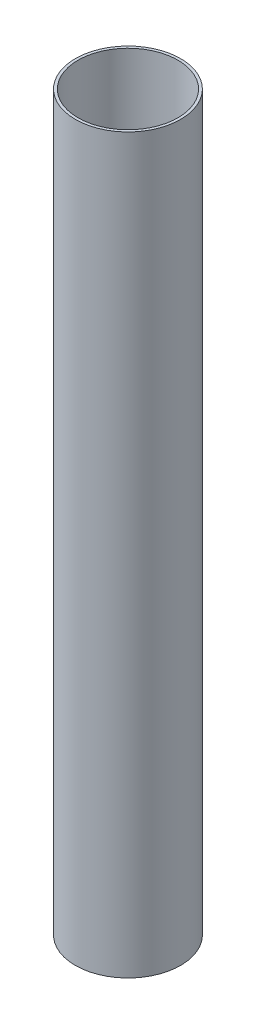
ISO-10303-21;
HEADER;
FILE_DESCRIPTION(('STEP AP214'),'2;1');
FILE_NAME('part.step','',(''),(''),'','','');
FILE_SCHEMA(('AUTOMOTIVE_DESIGN { 1 0 10303 214 1 1 1 1 }'));
ENDSEC;
DATA;
#1=APPLICATION_CONTEXT('core data for automotive mechanical design processes');
#2=APPLICATION_PROTOCOL_DEFINITION('international standard','automotive_design',2000,#1);
#3=PRODUCT_CONTEXT('',#1,'mechanical');
#4=PRODUCT('Part','Part','',(#3));
#5=PRODUCT_RELATED_PRODUCT_CATEGORY('part','',(#4));
#6=PRODUCT_DEFINITION_FORMATION('','',#4);
#7=PRODUCT_DEFINITION_CONTEXT('part definition',#1,'design');
#8=PRODUCT_DEFINITION('design','',#6,#7);
#9=PRODUCT_DEFINITION_SHAPE('','',#8);
#10=(LENGTH_UNIT() NAMED_UNIT(*) SI_UNIT(.MILLI.,.METRE.));
#11=(NAMED_UNIT(*) PLANE_ANGLE_UNIT() SI_UNIT($,.RADIAN.));
#12=(NAMED_UNIT(*) SI_UNIT($,.STERADIAN.) SOLID_ANGLE_UNIT());
#13=UNCERTAINTY_MEASURE_WITH_UNIT(LENGTH_MEASURE(1.E-05),#10,'distance_accuracy_value','');
#14=(GEOMETRIC_REPRESENTATION_CONTEXT(3) GLOBAL_UNCERTAINTY_ASSIGNED_CONTEXT((#13)) GLOBAL_UNIT_ASSIGNED_CONTEXT((#10,
#11,#12)) REPRESENTATION_CONTEXT('',''));
#15=CARTESIAN_POINT('',(0.,0.,0.));
#16=DIRECTION('',(0.,0.,1.));
#17=DIRECTION('',(1.,0.,0.));
#18=AXIS2_PLACEMENT_3D('',#15,#16,#17);
#19=CARTESIAN_POINT('',(0.,-558.8,0.));
#20=DIRECTION('',(0.,1.,0.));
#21=DIRECTION('',(0.,0.,1.));
#22=AXIS2_PLACEMENT_3D('',#19,#20,#21);
#23=CYLINDRICAL_SURFACE('',#22,40.1574);
#24=CARTESIAN_POINT('',(0.,-558.8,0.));
#25=DIRECTION('',(0.,1.,0.));
#26=DIRECTION('',(0.,0.,1.));
#27=AXIS2_PLACEMENT_3D('',#24,#25,#26);
#28=CIRCLE('',#27,40.1574);
#29=CARTESIAN_POINT('',(0.,-558.8,40.1574));
#30=VERTEX_POINT('',#29);
#31=EDGE_CURVE('E10',#30,#30,#28,.T.);
#32=ORIENTED_EDGE('',*,*,#31,.T.);
#33=EDGE_LOOP('',(#32));
#34=FACE_BOUND('',#33,.T.);
#35=CARTESIAN_POINT('',(0.,0.,0.));
#36=DIRECTION('',(0.,1.,0.));
#37=DIRECTION('',(0.,0.,1.));
#38=AXIS2_PLACEMENT_3D('',#35,#36,#37);
#39=CIRCLE('',#38,40.1574);
#40=CARTESIAN_POINT('',(0.,0.,40.1574));
#41=VERTEX_POINT('',#40);
#42=EDGE_CURVE('E44',#41,#41,#39,.T.);
#43=ORIENTED_EDGE('',*,*,#42,.F.);
#44=EDGE_LOOP('',(#43));
#45=FACE_BOUND('',#44,.T.);
#46=ADVANCED_FACE('F41',(#34,#45),#23,.T.);
#47=CARTESIAN_POINT('',(0.,-558.8,0.));
#48=DIRECTION('',(0.,1.,0.));
#49=DIRECTION('',(0.,0.,1.));
#50=AXIS2_PLACEMENT_3D('',#47,#48,#49);
#51=PLANE('',#50);
#52=CARTESIAN_POINT('',(0.,-558.8,0.));
#53=DIRECTION('',(0.,1.,0.));
#54=DIRECTION('',(0.,0.,1.));
#55=AXIS2_PLACEMENT_3D('',#52,#53,#54);
#56=CIRCLE('',#55,38.1);
#57=CARTESIAN_POINT('',(0.,-558.8,38.1));
#58=VERTEX_POINT('',#57);
#59=EDGE_CURVE('E53',#58,#58,#56,.T.);
#60=ORIENTED_EDGE('',*,*,#59,.T.);
#61=EDGE_LOOP('',(#60));
#62=FACE_BOUND('',#61,.T.);
#63=ORIENTED_EDGE('',*,*,#31,.F.);
#64=EDGE_LOOP('',(#63));
#65=FACE_BOUND('',#64,.T.);
#66=ADVANCED_FACE('F63',(#62,#65),#51,.F.);
#67=CARTESIAN_POINT('',(0.,0.,0.));
#68=DIRECTION('',(0.,1.,0.));
#69=DIRECTION('',(0.,0.,1.));
#70=AXIS2_PLACEMENT_3D('',#67,#68,#69);
#71=PLANE('',#70);
#72=CARTESIAN_POINT('',(0.,0.,0.));
#73=DIRECTION('',(0.,1.,0.));
#74=DIRECTION('',(0.,0.,1.));
#75=AXIS2_PLACEMENT_3D('',#72,#73,#74);
#76=CIRCLE('',#75,38.1);
#77=CARTESIAN_POINT('',(0.,0.,38.1));
#78=VERTEX_POINT('',#77);
#79=EDGE_CURVE('E55',#78,#78,#76,.T.);
#80=ORIENTED_EDGE('',*,*,#79,.F.);
#81=EDGE_LOOP('',(#80));
#82=FACE_BOUND('',#81,.T.);
#83=ORIENTED_EDGE('',*,*,#42,.T.);
#84=EDGE_LOOP('',(#83));
#85=FACE_BOUND('',#84,.T.);
#86=ADVANCED_FACE('F69',(#82,#85),#71,.T.);
#87=CARTESIAN_POINT('',(0.,-558.8,0.));
#88=DIRECTION('',(0.,1.,0.));
#89=DIRECTION('',(0.,0.,1.));
#90=AXIS2_PLACEMENT_3D('',#87,#88,#89);
#91=CYLINDRICAL_SURFACE('',#90,38.1);
#92=ORIENTED_EDGE('',*,*,#59,.F.);
#93=EDGE_LOOP('',(#92));
#94=FACE_BOUND('',#93,.T.);
#95=ORIENTED_EDGE('',*,*,#79,.T.);
#96=EDGE_LOOP('',(#95));
#97=FACE_BOUND('',#96,.T.);
#98=ADVANCED_FACE('F66',(#94,#97),#91,.F.);
#99=CLOSED_SHELL('',(#46,#66,#86,#98));
#100=MANIFOLD_SOLID_BREP('B2',#99);
#101=ADVANCED_BREP_SHAPE_REPRESENTATION('',(#18,#100),#14);
#102=SHAPE_DEFINITION_REPRESENTATION(#9,#101);
ENDSEC;
END-ISO-10303-21;
